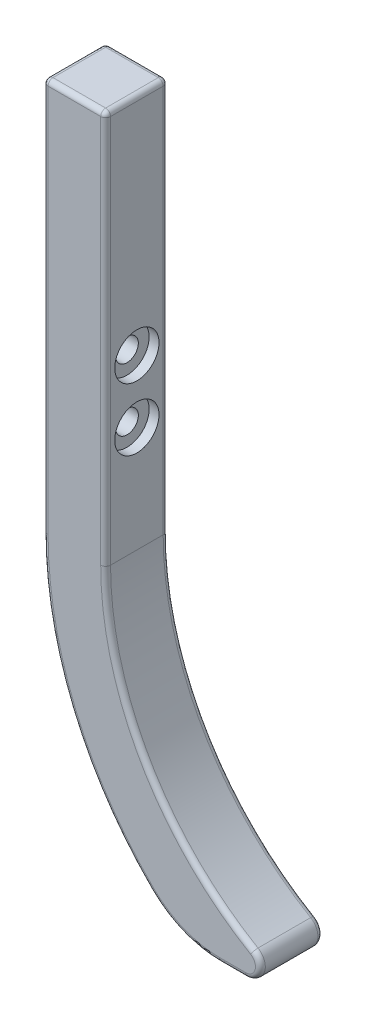
ISO-10303-21;
HEADER;
FILE_DESCRIPTION(('STEP AP214'),'2;1');
FILE_NAME('part.step','',(''),(''),'','','');
FILE_SCHEMA(('AUTOMOTIVE_DESIGN { 1 0 10303 214 1 1 1 1 }'));
ENDSEC;
DATA;
#1=APPLICATION_CONTEXT('core data for automotive mechanical design processes');
#2=APPLICATION_PROTOCOL_DEFINITION('international standard','automotive_design',2000,#1);
#3=PRODUCT_CONTEXT('',#1,'mechanical');
#4=PRODUCT('Part','Part','',(#3));
#5=PRODUCT_RELATED_PRODUCT_CATEGORY('part','',(#4));
#6=PRODUCT_DEFINITION_FORMATION('','',#4);
#7=PRODUCT_DEFINITION_CONTEXT('part definition',#1,'design');
#8=PRODUCT_DEFINITION('design','',#6,#7);
#9=PRODUCT_DEFINITION_SHAPE('','',#8);
#10=(LENGTH_UNIT() NAMED_UNIT(*) SI_UNIT(.MILLI.,.METRE.));
#11=(NAMED_UNIT(*) PLANE_ANGLE_UNIT() SI_UNIT($,.RADIAN.));
#12=(NAMED_UNIT(*) SI_UNIT($,.STERADIAN.) SOLID_ANGLE_UNIT());
#13=UNCERTAINTY_MEASURE_WITH_UNIT(LENGTH_MEASURE(1.E-05),#10,'distance_accuracy_value','');
#14=(GEOMETRIC_REPRESENTATION_CONTEXT(3) GLOBAL_UNCERTAINTY_ASSIGNED_CONTEXT((#13)) GLOBAL_UNIT_ASSIGNED_CONTEXT((#10,
#11,#12)) REPRESENTATION_CONTEXT('',''));
#15=CARTESIAN_POINT('',(0.,0.,0.));
#16=DIRECTION('',(0.,0.,1.));
#17=DIRECTION('',(1.,0.,0.));
#18=AXIS2_PLACEMENT_3D('',#15,#16,#17);
#19=CARTESIAN_POINT('',(-73.501,21.58,6.35));
#20=DIRECTION('',(1.,0.,0.));
#21=DIRECTION('',(0.,0.,-1.));
#22=AXIS2_PLACEMENT_3D('',#19,#20,#21);
#23=CYLINDRICAL_SURFACE('',#22,2.3);
#24=CARTESIAN_POINT('',(-73.5,21.58,6.35));
#25=DIRECTION('',(1.,0.,0.));
#26=DIRECTION('',(0.,1.,0.));
#27=AXIS2_PLACEMENT_3D('',#24,#25,#26);
#28=CIRCLE('',#27,2.3);
#29=CARTESIAN_POINT('',(-73.5,23.88,6.35));
#30=VERTEX_POINT('',#29);
#31=EDGE_CURVE('E398',#30,#30,#28,.F.);
#32=ORIENTED_EDGE('',*,*,#31,.T.);
#33=EDGE_LOOP('',(#32));
#34=FACE_BOUND('',#33,.T.);
#35=CARTESIAN_POINT('',(-62.8,21.58,6.35));
#36=DIRECTION('',(1.,0.,0.));
#37=DIRECTION('',(0.,0.,-1.));
#38=AXIS2_PLACEMENT_3D('',#35,#36,#37);
#39=CIRCLE('',#38,2.3);
#40=CARTESIAN_POINT('',(-62.8,21.58,4.05));
#41=VERTEX_POINT('',#40);
#42=EDGE_CURVE('E385',#41,#41,#39,.T.);
#43=ORIENTED_EDGE('',*,*,#42,.T.);
#44=EDGE_LOOP('',(#43));
#45=FACE_BOUND('',#44,.T.);
#46=ADVANCED_FACE('F40',(#34,#45),#23,.F.);
#47=CARTESIAN_POINT('',(-73.501,34.28,6.35));
#48=DIRECTION('',(1.,0.,0.));
#49=DIRECTION('',(0.,0.,-1.));
#50=AXIS2_PLACEMENT_3D('',#47,#48,#49);
#51=CYLINDRICAL_SURFACE('',#50,2.3);
#52=CARTESIAN_POINT('',(-73.5,34.28,6.35));
#53=DIRECTION('',(1.,0.,0.));
#54=DIRECTION('',(0.,1.,0.));
#55=AXIS2_PLACEMENT_3D('',#52,#53,#54);
#56=CIRCLE('',#55,2.3);
#57=CARTESIAN_POINT('',(-73.5,36.58,6.35));
#58=VERTEX_POINT('',#57);
#59=EDGE_CURVE('E191',#58,#58,#56,.F.);
#60=ORIENTED_EDGE('',*,*,#59,.T.);
#61=EDGE_LOOP('',(#60));
#62=FACE_BOUND('',#61,.T.);
#63=CARTESIAN_POINT('',(-62.8,34.28,6.35));
#64=DIRECTION('',(1.,0.,0.));
#65=DIRECTION('',(0.,0.,-1.));
#66=AXIS2_PLACEMENT_3D('',#63,#64,#65);
#67=CIRCLE('',#66,2.3);
#68=CARTESIAN_POINT('',(-62.8,34.28,4.05));
#69=VERTEX_POINT('',#68);
#70=EDGE_CURVE('E581',#69,#69,#67,.T.);
#71=ORIENTED_EDGE('',*,*,#70,.T.);
#72=EDGE_LOOP('',(#71));
#73=FACE_BOUND('',#72,.T.);
#74=ADVANCED_FACE('F517',(#62,#73),#51,.F.);
#75=CARTESIAN_POINT('',(0.,0.,12.7));
#76=DIRECTION('',(0.,0.,-1.));
#77=DIRECTION('',(-1.,0.,0.));
#78=AXIS2_PLACEMENT_3D('',#75,#76,#77);
#79=CYLINDRICAL_SURFACE('',#78,60.8);
#80=DIRECTION('',(0.,0.,-1.));
#81=VECTOR('',#80,1.);
#82=CARTESIAN_POINT('',(-30.8128916609415,-52.4137931034483,12.7));
#83=LINE('',#82,#81);
#84=CARTESIAN_POINT('',(-30.8128916609415,-52.4137931034483,11.7));
#85=VERTEX_POINT('',#84);
#86=CARTESIAN_POINT('',(-30.8128916609415,-52.4137931034483,1.));
#87=VERTEX_POINT('',#86);
#88=EDGE_CURVE('E406',#85,#87,#83,.T.);
#89=ORIENTED_EDGE('',*,*,#88,.T.);
#90=CARTESIAN_POINT('',(0.,0.,1.));
#91=DIRECTION('',(0.,0.,-1.));
#92=DIRECTION('',(-1.,0.,0.));
#93=AXIS2_PLACEMENT_3D('',#90,#91,#92);
#94=CIRCLE('',#93,60.8);
#95=CARTESIAN_POINT('',(-60.8,0.,1.));
#96=VERTEX_POINT('',#95);
#97=EDGE_CURVE('E328',#87,#96,#94,.T.);
#98=ORIENTED_EDGE('',*,*,#97,.T.);
#99=DIRECTION('',(0.,0.,-1.));
#100=VECTOR('',#99,1.);
#101=CARTESIAN_POINT('',(-60.8,0.,12.7));
#102=LINE('',#101,#100);
#103=CARTESIAN_POINT('',(-60.8,0.,11.7));
#104=VERTEX_POINT('',#103);
#105=EDGE_CURVE('E190',#104,#96,#102,.T.);
#106=ORIENTED_EDGE('',*,*,#105,.F.);
#107=CARTESIAN_POINT('',(0.,0.,11.7));
#108=DIRECTION('',(0.,0.,-1.));
#109=DIRECTION('',(-1.,0.,0.));
#110=AXIS2_PLACEMENT_3D('',#107,#108,#109);
#111=CIRCLE('',#110,60.8);
#112=EDGE_CURVE('E334',#104,#85,#111,.F.);
#113=ORIENTED_EDGE('',*,*,#112,.T.);
#114=EDGE_LOOP('',(#89,#98,#106,#113));
#115=FACE_BOUND('',#114,.T.);
#116=ADVANCED_FACE('F467',(#115),#79,.F.);
#117=CARTESIAN_POINT('',(-60.8,0.,12.7));
#118=DIRECTION('',(-1.,0.,0.));
#119=DIRECTION('',(0.,0.,1.));
#120=AXIS2_PLACEMENT_3D('',#117,#118,#119);
#121=PLANE('',#120);
#122=CARTESIAN_POINT('',(-60.8,34.28,6.35));
#123=DIRECTION('',(1.,0.,0.));
#124=DIRECTION('',(0.,0.,-1.));
#125=AXIS2_PLACEMENT_3D('',#122,#123,#124);
#126=CIRCLE('',#125,4.5);
#127=CARTESIAN_POINT('',(-60.8,34.28,1.85));
#128=VERTEX_POINT('',#127);
#129=EDGE_CURVE('E578',#128,#128,#126,.T.);
#130=ORIENTED_EDGE('',*,*,#129,.F.);
#131=EDGE_LOOP('',(#130));
#132=FACE_BOUND('',#131,.T.);
#133=CARTESIAN_POINT('',(-60.8,21.58,6.35));
#134=DIRECTION('',(1.,0.,0.));
#135=DIRECTION('',(0.,0.,-1.));
#136=AXIS2_PLACEMENT_3D('',#133,#134,#135);
#137=CIRCLE('',#136,4.5);
#138=CARTESIAN_POINT('',(-60.8,21.58,1.85));
#139=VERTEX_POINT('',#138);
#140=EDGE_CURVE('E378',#139,#139,#137,.T.);
#141=ORIENTED_EDGE('',*,*,#140,.F.);
#142=EDGE_LOOP('',(#141));
#143=FACE_BOUND('',#142,.T.);
#144=DIRECTION('',(0.,1.,0.));
#145=VECTOR('',#144,1.);
#146=CARTESIAN_POINT('',(-60.8,80.,1.));
#147=LINE('',#146,#145);
#148=CARTESIAN_POINT('',(-60.8,79.,1.));
#149=VERTEX_POINT('',#148);
#150=EDGE_CURVE('E235',#96,#149,#147,.T.);
#151=ORIENTED_EDGE('',*,*,#150,.T.);
#152=DIRECTION('',(0.,0.,-1.));
#153=VECTOR('',#152,1.);
#154=CARTESIAN_POINT('',(-60.8,79.,12.7));
#155=LINE('',#154,#153);
#156=CARTESIAN_POINT('',(-60.8,79.,11.7));
#157=VERTEX_POINT('',#156);
#158=EDGE_CURVE('E248',#149,#157,#155,.F.);
#159=ORIENTED_EDGE('',*,*,#158,.T.);
#160=DIRECTION('',(0.,1.,0.));
#161=VECTOR('',#160,1.);
#162=CARTESIAN_POINT('',(-60.8,0.,11.7));
#163=LINE('',#162,#161);
#164=EDGE_CURVE('E323',#157,#104,#163,.F.);
#165=ORIENTED_EDGE('',*,*,#164,.T.);
#166=ORIENTED_EDGE('',*,*,#105,.T.);
#167=EDGE_LOOP('',(#151,#159,#165,#166));
#168=FACE_BOUND('',#167,.T.);
#169=ADVANCED_FACE('F541',(#132,#143,#168),#121,.F.);
#170=CARTESIAN_POINT('',(-60.8,80.,12.7));
#171=DIRECTION('',(0.,-1.,0.));
#172=DIRECTION('',(0.,0.,-1.));
#173=AXIS2_PLACEMENT_3D('',#170,#171,#172);
#174=PLANE('',#173);
#175=DIRECTION('',(-1.,0.,0.));
#176=VECTOR('',#175,1.);
#177=CARTESIAN_POINT('',(-60.8,80.,11.7));
#178=LINE('',#177,#176);
#179=CARTESIAN_POINT('',(-72.5,80.,11.7));
#180=VERTEX_POINT('',#179);
#181=CARTESIAN_POINT('',(-61.8,80.,11.7));
#182=VERTEX_POINT('',#181);
#183=EDGE_CURVE('E234',#180,#182,#178,.F.);
#184=ORIENTED_EDGE('',*,*,#183,.T.);
#185=DIRECTION('',(0.,0.,-1.));
#186=VECTOR('',#185,1.);
#187=CARTESIAN_POINT('',(-61.8,80.,12.7));
#188=LINE('',#187,#186);
#189=CARTESIAN_POINT('',(-61.8,80.,1.));
#190=VERTEX_POINT('',#189);
#191=EDGE_CURVE('E244',#182,#190,#188,.T.);
#192=ORIENTED_EDGE('',*,*,#191,.T.);
#193=DIRECTION('',(-1.,0.,0.));
#194=VECTOR('',#193,1.);
#195=CARTESIAN_POINT('',(-72.5,80.,1.));
#196=LINE('',#195,#194);
#197=CARTESIAN_POINT('',(-72.5,80.,1.));
#198=VERTEX_POINT('',#197);
#199=EDGE_CURVE('E241',#190,#198,#196,.T.);
#200=ORIENTED_EDGE('',*,*,#199,.T.);
#201=DIRECTION('',(0.,0.,-1.));
#202=VECTOR('',#201,1.);
#203=CARTESIAN_POINT('',(-72.5,80.,12.7));
#204=LINE('',#203,#202);
#205=EDGE_CURVE('E238',#198,#180,#204,.F.);
#206=ORIENTED_EDGE('',*,*,#205,.T.);
#207=EDGE_LOOP('',(#184,#192,#200,#206));
#208=FACE_BOUND('',#207,.T.);
#209=ADVANCED_FACE('F303',(#208),#174,.F.);
#210=CARTESIAN_POINT('',(-73.5,80.,12.7));
#211=DIRECTION('',(1.,0.,0.));
#212=DIRECTION('',(0.,1.,0.));
#213=AXIS2_PLACEMENT_3D('',#210,#211,#212);
#214=PLANE('',#213);
#215=ORIENTED_EDGE('',*,*,#59,.F.);
#216=EDGE_LOOP('',(#215));
#217=FACE_BOUND('',#216,.T.);
#218=ORIENTED_EDGE('',*,*,#31,.F.);
#219=EDGE_LOOP('',(#218));
#220=FACE_BOUND('',#219,.T.);
#221=DIRECTION('',(0.,-1.,0.));
#222=VECTOR('',#221,1.);
#223=CARTESIAN_POINT('',(-73.5,80.,11.7));
#224=LINE('',#223,#222);
#225=CARTESIAN_POINT('',(-73.5,0.,11.7));
#226=VERTEX_POINT('',#225);
#227=CARTESIAN_POINT('',(-73.5,79.,11.7));
#228=VERTEX_POINT('',#227);
#229=EDGE_CURVE('E184',#226,#228,#224,.F.);
#230=ORIENTED_EDGE('',*,*,#229,.T.);
#231=DIRECTION('',(0.,0.,-1.));
#232=VECTOR('',#231,1.);
#233=CARTESIAN_POINT('',(-73.5,79.,12.7));
#234=LINE('',#233,#232);
#235=CARTESIAN_POINT('',(-73.5,79.,1.));
#236=VERTEX_POINT('',#235);
#237=EDGE_CURVE('E260',#228,#236,#234,.T.);
#238=ORIENTED_EDGE('',*,*,#237,.T.);
#239=DIRECTION('',(0.,-1.,0.));
#240=VECTOR('',#239,1.);
#241=CARTESIAN_POINT('',(-73.5,0.,1.));
#242=LINE('',#241,#240);
#243=CARTESIAN_POINT('',(-73.5,0.,1.));
#244=VERTEX_POINT('',#243);
#245=EDGE_CURVE('E187',#236,#244,#242,.T.);
#246=ORIENTED_EDGE('',*,*,#245,.T.);
#247=DIRECTION('',(0.,0.,-1.));
#248=VECTOR('',#247,1.);
#249=CARTESIAN_POINT('',(-73.5,0.,12.7));
#250=LINE('',#249,#248);
#251=EDGE_CURVE('E171',#226,#244,#250,.T.);
#252=ORIENTED_EDGE('',*,*,#251,.F.);
#253=EDGE_LOOP('',(#230,#238,#246,#252));
#254=FACE_BOUND('',#253,.T.);
#255=ADVANCED_FACE('F183',(#217,#220,#254),#214,.F.);
#256=CARTESIAN_POINT('',(0.,0.,12.7));
#257=DIRECTION('',(0.,0.,-1.));
#258=DIRECTION('',(-1.,0.,0.));
#259=AXIS2_PLACEMENT_3D('',#256,#257,#258);
#260=CYLINDRICAL_SURFACE('',#259,73.5);
#261=ORIENTED_EDGE('',*,*,#251,.T.);
#262=CARTESIAN_POINT('',(0.,0.,1.));
#263=DIRECTION('',(0.,0.,-1.));
#264=DIRECTION('',(-1.,0.,0.));
#265=AXIS2_PLACEMENT_3D('',#262,#263,#264);
#266=CIRCLE('',#265,73.5);
#267=CARTESIAN_POINT('',(-51.7380377284977,-52.2056074766355,1.));
#268=VERTEX_POINT('',#267);
#269=EDGE_CURVE('E179',#244,#268,#266,.F.);
#270=ORIENTED_EDGE('',*,*,#269,.T.);
#271=DIRECTION('',(0.,0.,-1.));
#272=VECTOR('',#271,1.);
#273=CARTESIAN_POINT('',(-51.7380377284977,-52.2056074766355,12.7));
#274=LINE('',#273,#272);
#275=CARTESIAN_POINT('',(-51.7380377284977,-52.2056074766355,11.7));
#276=VERTEX_POINT('',#275);
#277=EDGE_CURVE('E173',#268,#276,#274,.F.);
#278=ORIENTED_EDGE('',*,*,#277,.T.);
#279=CARTESIAN_POINT('',(0.,0.,11.7));
#280=DIRECTION('',(0.,0.,-1.));
#281=DIRECTION('',(-1.,0.,0.));
#282=AXIS2_PLACEMENT_3D('',#279,#280,#281);
#283=CIRCLE('',#282,73.5);
#284=EDGE_CURVE('E168',#276,#226,#283,.T.);
#285=ORIENTED_EDGE('',*,*,#284,.T.);
#286=EDGE_LOOP('',(#261,#270,#278,#285));
#287=FACE_BOUND('',#286,.T.);
#288=ADVANCED_FACE('F170',(#287),#260,.T.);
#289=CARTESIAN_POINT('',(-18.2384209842847,-58.,12.7));
#290=DIRECTION('',(0.,1.,0.));
#291=DIRECTION('',(0.,0.,1.));
#292=AXIS2_PLACEMENT_3D('',#289,#290,#291);
#293=PLANE('',#292);
#294=DIRECTION('',(0.,0.,-1.));
#295=VECTOR('',#294,1.);
#296=CARTESIAN_POINT('',(-37.659660115301,-58.,12.7));
#297=LINE('',#296,#295);
#298=CARTESIAN_POINT('',(-37.659660115301,-58.,11.7));
#299=VERTEX_POINT('',#298);
#300=CARTESIAN_POINT('',(-37.659660115301,-58.,1.));
#301=VERTEX_POINT('',#300);
#302=EDGE_CURVE('E414',#299,#301,#297,.T.);
#303=ORIENTED_EDGE('',*,*,#302,.T.);
#304=DIRECTION('',(1.,0.,0.));
#305=VECTOR('',#304,1.);
#306=CARTESIAN_POINT('',(-32.3332646047379,-58.,1.));
#307=LINE('',#306,#305);
#308=CARTESIAN_POINT('',(-32.3332646047379,-58.,1.));
#309=VERTEX_POINT('',#308);
#310=EDGE_CURVE('E454',#301,#309,#307,.T.);
#311=ORIENTED_EDGE('',*,*,#310,.T.);
#312=DIRECTION('',(0.,0.,-1.));
#313=VECTOR('',#312,1.);
#314=CARTESIAN_POINT('',(-32.3332646047379,-58.,12.7));
#315=LINE('',#314,#313);
#316=CARTESIAN_POINT('',(-32.3332646047379,-58.,11.7));
#317=VERTEX_POINT('',#316);
#318=EDGE_CURVE('E410',#309,#317,#315,.F.);
#319=ORIENTED_EDGE('',*,*,#318,.T.);
#320=DIRECTION('',(1.,0.,0.));
#321=VECTOR('',#320,1.);
#322=CARTESIAN_POINT('',(-18.2384209842847,-58.,11.7));
#323=LINE('',#322,#321);
#324=EDGE_CURVE('E451',#317,#299,#323,.F.);
#325=ORIENTED_EDGE('',*,*,#324,.T.);
#326=EDGE_LOOP('',(#303,#311,#319,#325));
#327=FACE_BOUND('',#326,.T.);
#328=ADVANCED_FACE('F487',(#327),#293,.F.);
#329=CARTESIAN_POINT('',(0.,0.,12.7));
#330=DIRECTION('',(0.,0.,-1.));
#331=DIRECTION('',(-1.,0.,0.));
#332=AXIS2_PLACEMENT_3D('',#329,#330,#331);
#333=PLANE('',#332);
#334=DIRECTION('',(0.,1.,0.));
#335=VECTOR('',#334,1.);
#336=CARTESIAN_POINT('',(-61.8,0.,12.7));
#337=LINE('',#336,#335);
#338=CARTESIAN_POINT('',(-61.8,0.,12.7));
#339=VERTEX_POINT('',#338);
#340=CARTESIAN_POINT('',(-61.8,79.,12.7));
#341=VERTEX_POINT('',#340);
#342=EDGE_CURVE('E322',#339,#341,#337,.T.);
#343=ORIENTED_EDGE('',*,*,#342,.T.);
#344=DIRECTION('',(-1.,0.,0.));
#345=VECTOR('',#344,1.);
#346=CARTESIAN_POINT('',(0.,79.,12.7));
#347=LINE('',#346,#345);
#348=CARTESIAN_POINT('',(-72.5,79.,12.7));
#349=VERTEX_POINT('',#348);
#350=EDGE_CURVE('E11',#341,#349,#347,.T.);
#351=ORIENTED_EDGE('',*,*,#350,.T.);
#352=DIRECTION('',(0.,-1.,0.));
#353=VECTOR('',#352,1.);
#354=CARTESIAN_POINT('',(-72.5,0.,12.7));
#355=LINE('',#354,#353);
#356=CARTESIAN_POINT('',(-72.5,0.,12.7));
#357=VERTEX_POINT('',#356);
#358=EDGE_CURVE('E348',#349,#357,#355,.T.);
#359=ORIENTED_EDGE('',*,*,#358,.T.);
#360=CARTESIAN_POINT('',(0.,0.,12.7));
#361=DIRECTION('',(0.,0.,-1.));
#362=DIRECTION('',(-1.,0.,0.));
#363=AXIS2_PLACEMENT_3D('',#360,#361,#362);
#364=CIRCLE('',#363,72.5);
#365=CARTESIAN_POINT('',(-51.0341188478379,-51.4953271028038,12.7));
#366=VERTEX_POINT('',#365);
#367=EDGE_CURVE('E200',#357,#366,#364,.F.);
#368=ORIENTED_EDGE('',*,*,#367,.T.);
#369=CARTESIAN_POINT('',(-37.659660115301,-38.,12.7));
#370=DIRECTION('',(0.,0.,-1.));
#371=DIRECTION('',(-1.,0.,0.));
#372=AXIS2_PLACEMENT_3D('',#369,#370,#371);
#373=CIRCLE('',#372,19.);
#374=CARTESIAN_POINT('',(-37.659660115301,-57.,12.7));
#375=VERTEX_POINT('',#374);
#376=EDGE_CURVE('E343',#366,#375,#373,.F.);
#377=ORIENTED_EDGE('',*,*,#376,.T.);
#378=DIRECTION('',(1.,0.,0.));
#379=VECTOR('',#378,1.);
#380=CARTESIAN_POINT('',(0.,-57.,12.7));
#381=LINE('',#380,#379);
#382=CARTESIAN_POINT('',(-32.3332646047379,-57.,12.7));
#383=VERTEX_POINT('',#382);
#384=EDGE_CURVE('E340',#375,#383,#381,.T.);
#385=ORIENTED_EDGE('',*,*,#384,.T.);
#386=CARTESIAN_POINT('',(-32.3332646047379,-55.,12.7));
#387=DIRECTION('',(0.,0.,-1.));
#388=DIRECTION('',(-1.,0.,0.));
#389=AXIS2_PLACEMENT_3D('',#386,#387,#388);
#390=CIRCLE('',#389,2.);
#391=CARTESIAN_POINT('',(-31.3196826422069,-53.2758620689655,12.7));
#392=VERTEX_POINT('',#391);
#393=EDGE_CURVE('E332',#383,#392,#390,.F.);
#394=ORIENTED_EDGE('',*,*,#393,.T.);
#395=CARTESIAN_POINT('',(0.,0.,12.7));
#396=DIRECTION('',(0.,0.,-1.));
#397=DIRECTION('',(-1.,0.,0.));
#398=AXIS2_PLACEMENT_3D('',#395,#396,#397);
#399=CIRCLE('',#398,61.8);
#400=EDGE_CURVE('E326',#392,#339,#399,.T.);
#401=ORIENTED_EDGE('',*,*,#400,.T.);
#402=EDGE_LOOP('',(#343,#351,#359,#368,#377,#385,#394,#401));
#403=FACE_BOUND('',#402,.T.);
#404=ADVANCED_FACE('F324',(#403),#333,.F.);
#405=CARTESIAN_POINT('',(0.,0.,0.));
#406=DIRECTION('',(0.,0.,-1.));
#407=DIRECTION('',(-1.,0.,0.));
#408=AXIS2_PLACEMENT_3D('',#405,#406,#407);
#409=PLANE('',#408);
#410=DIRECTION('',(0.,-1.,0.));
#411=VECTOR('',#410,1.);
#412=CARTESIAN_POINT('',(-72.5,80.,0.));
#413=LINE('',#412,#411);
#414=CARTESIAN_POINT('',(-72.5,0.,0.));
#415=VERTEX_POINT('',#414);
#416=CARTESIAN_POINT('',(-72.5,79.,0.));
#417=VERTEX_POINT('',#416);
#418=EDGE_CURVE('E180',#415,#417,#413,.F.);
#419=ORIENTED_EDGE('',*,*,#418,.T.);
#420=DIRECTION('',(-1.,0.,0.));
#421=VECTOR('',#420,1.);
#422=CARTESIAN_POINT('',(-61.8,79.,0.));
#423=LINE('',#422,#421);
#424=CARTESIAN_POINT('',(-61.8,79.,0.));
#425=VERTEX_POINT('',#424);
#426=EDGE_CURVE('E254',#417,#425,#423,.F.);
#427=ORIENTED_EDGE('',*,*,#426,.T.);
#428=DIRECTION('',(0.,1.,0.));
#429=VECTOR('',#428,1.);
#430=CARTESIAN_POINT('',(-61.8,0.,0.));
#431=LINE('',#430,#429);
#432=CARTESIAN_POINT('',(-61.8,0.,0.));
#433=VERTEX_POINT('',#432);
#434=EDGE_CURVE('E422',#425,#433,#431,.F.);
#435=ORIENTED_EDGE('',*,*,#434,.T.);
#436=CARTESIAN_POINT('',(0.,0.,0.));
#437=DIRECTION('',(0.,0.,-1.));
#438=DIRECTION('',(-1.,0.,0.));
#439=AXIS2_PLACEMENT_3D('',#436,#437,#438);
#440=CIRCLE('',#439,61.8);
#441=CARTESIAN_POINT('',(-31.3196826422069,-53.2758620689655,0.));
#442=VERTEX_POINT('',#441);
#443=EDGE_CURVE('E425',#433,#442,#440,.F.);
#444=ORIENTED_EDGE('',*,*,#443,.T.);
#445=CARTESIAN_POINT('',(-32.3332646047379,-55.,0.));
#446=DIRECTION('',(0.,0.,-1.));
#447=DIRECTION('',(-1.,0.,0.));
#448=AXIS2_PLACEMENT_3D('',#445,#446,#447);
#449=CIRCLE('',#448,2.);
#450=CARTESIAN_POINT('',(-32.3332646047379,-57.,0.));
#451=VERTEX_POINT('',#450);
#452=EDGE_CURVE('E428',#442,#451,#449,.T.);
#453=ORIENTED_EDGE('',*,*,#452,.T.);
#454=DIRECTION('',(1.,0.,0.));
#455=VECTOR('',#454,1.);
#456=CARTESIAN_POINT('',(-37.659660115301,-57.,0.));
#457=LINE('',#456,#455);
#458=CARTESIAN_POINT('',(-37.659660115301,-57.,0.));
#459=VERTEX_POINT('',#458);
#460=EDGE_CURVE('E431',#451,#459,#457,.F.);
#461=ORIENTED_EDGE('',*,*,#460,.T.);
#462=CARTESIAN_POINT('',(-37.659660115301,-38.,0.));
#463=DIRECTION('',(0.,0.,-1.));
#464=DIRECTION('',(-1.,0.,0.));
#465=AXIS2_PLACEMENT_3D('',#462,#463,#464);
#466=CIRCLE('',#465,19.);
#467=CARTESIAN_POINT('',(-51.0341188478379,-51.4953271028038,0.));
#468=VERTEX_POINT('',#467);
#469=EDGE_CURVE('E434',#459,#468,#466,.T.);
#470=ORIENTED_EDGE('',*,*,#469,.T.);
#471=CARTESIAN_POINT('',(0.,0.,0.));
#472=DIRECTION('',(0.,0.,-1.));
#473=DIRECTION('',(-1.,0.,0.));
#474=AXIS2_PLACEMENT_3D('',#471,#472,#473);
#475=CIRCLE('',#474,72.5);
#476=EDGE_CURVE('E437',#468,#415,#475,.T.);
#477=ORIENTED_EDGE('',*,*,#476,.T.);
#478=EDGE_LOOP('',(#419,#427,#435,#444,#453,#461,#470,#477));
#479=FACE_BOUND('',#478,.T.);
#480=ADVANCED_FACE('F504',(#479),#409,.T.);
#481=CARTESIAN_POINT('',(-32.3332646047379,-55.,12.7));
#482=DIRECTION('',(0.,0.,-1.));
#483=DIRECTION('',(-1.,0.,0.));
#484=AXIS2_PLACEMENT_3D('',#481,#482,#483);
#485=CYLINDRICAL_SURFACE('',#484,3.);
#486=ORIENTED_EDGE('',*,*,#318,.F.);
#487=CARTESIAN_POINT('',(-32.3332646047379,-55.,1.));
#488=DIRECTION('',(0.,0.,-1.));
#489=DIRECTION('',(-1.,0.,0.));
#490=AXIS2_PLACEMENT_3D('',#487,#488,#489);
#491=CIRCLE('',#490,3.);
#492=EDGE_CURVE('E460',#309,#87,#491,.F.);
#493=ORIENTED_EDGE('',*,*,#492,.T.);
#494=ORIENTED_EDGE('',*,*,#88,.F.);
#495=CARTESIAN_POINT('',(-32.3332646047379,-55.,11.7));
#496=DIRECTION('',(0.,0.,-1.));
#497=DIRECTION('',(-1.,0.,0.));
#498=AXIS2_PLACEMENT_3D('',#495,#496,#497);
#499=CIRCLE('',#498,3.);
#500=EDGE_CURVE('E457',#85,#317,#499,.T.);
#501=ORIENTED_EDGE('',*,*,#500,.T.);
#502=EDGE_LOOP('',(#486,#493,#494,#501));
#503=FACE_BOUND('',#502,.T.);
#504=ADVANCED_FACE('F472',(#503),#485,.T.);
#505=CARTESIAN_POINT('',(-37.659660115301,-38.,12.7));
#506=DIRECTION('',(0.,0.,-1.));
#507=DIRECTION('',(-1.,0.,0.));
#508=AXIS2_PLACEMENT_3D('',#505,#506,#507);
#509=CYLINDRICAL_SURFACE('',#508,20.);
#510=ORIENTED_EDGE('',*,*,#277,.F.);
#511=CARTESIAN_POINT('',(-37.659660115301,-38.,1.));
#512=DIRECTION('',(0.,0.,-1.));
#513=DIRECTION('',(-1.,0.,0.));
#514=AXIS2_PLACEMENT_3D('',#511,#512,#513);
#515=CIRCLE('',#514,20.);
#516=EDGE_CURVE('E448',#268,#301,#515,.F.);
#517=ORIENTED_EDGE('',*,*,#516,.T.);
#518=ORIENTED_EDGE('',*,*,#302,.F.);
#519=CARTESIAN_POINT('',(-37.659660115301,-38.,11.7));
#520=DIRECTION('',(0.,0.,-1.));
#521=DIRECTION('',(-1.,0.,0.));
#522=AXIS2_PLACEMENT_3D('',#519,#520,#521);
#523=CIRCLE('',#522,20.);
#524=EDGE_CURVE('E445',#299,#276,#523,.T.);
#525=ORIENTED_EDGE('',*,*,#524,.T.);
#526=EDGE_LOOP('',(#510,#517,#518,#525));
#527=FACE_BOUND('',#526,.T.);
#528=ADVANCED_FACE('F490',(#527),#509,.T.);
#529=CARTESIAN_POINT('',(-62.8,34.28,6.35));
#530=DIRECTION('',(1.,0.,0.));
#531=DIRECTION('',(0.,0.,-1.));
#532=AXIS2_PLACEMENT_3D('',#529,#530,#531);
#533=CYLINDRICAL_SURFACE('',#532,4.5);
#534=CARTESIAN_POINT('',(-62.8,34.28,6.35));
#535=DIRECTION('',(1.,0.,0.));
#536=DIRECTION('',(0.,0.,-1.));
#537=AXIS2_PLACEMENT_3D('',#534,#535,#536);
#538=CIRCLE('',#537,4.5);
#539=CARTESIAN_POINT('',(-62.8,34.28,1.85));
#540=VERTEX_POINT('',#539);
#541=EDGE_CURVE('E401',#540,#540,#538,.T.);
#542=ORIENTED_EDGE('',*,*,#541,.F.);
#543=EDGE_LOOP('',(#542));
#544=FACE_BOUND('',#543,.T.);
#545=ORIENTED_EDGE('',*,*,#129,.T.);
#546=EDGE_LOOP('',(#545));
#547=FACE_BOUND('',#546,.T.);
#548=ADVANCED_FACE('F549',(#544,#547),#533,.F.);
#549=CARTESIAN_POINT('',(-62.8,0.,0.));
#550=DIRECTION('',(1.,0.,0.));
#551=DIRECTION('',(0.,0.,-1.));
#552=AXIS2_PLACEMENT_3D('',#549,#550,#551);
#553=PLANE('',#552);
#554=ORIENTED_EDGE('',*,*,#70,.F.);
#555=EDGE_LOOP('',(#554));
#556=FACE_BOUND('',#555,.T.);
#557=ORIENTED_EDGE('',*,*,#541,.T.);
#558=EDGE_LOOP('',(#557));
#559=FACE_BOUND('',#558,.T.);
#560=ADVANCED_FACE('F554',(#556,#559),#553,.T.);
#561=CARTESIAN_POINT('',(-62.8,21.58,6.35));
#562=DIRECTION('',(1.,0.,0.));
#563=DIRECTION('',(0.,0.,-1.));
#564=AXIS2_PLACEMENT_3D('',#561,#562,#563);
#565=CYLINDRICAL_SURFACE('',#564,4.5);
#566=CARTESIAN_POINT('',(-62.8,21.58,6.35));
#567=DIRECTION('',(1.,0.,0.));
#568=DIRECTION('',(0.,0.,-1.));
#569=AXIS2_PLACEMENT_3D('',#566,#567,#568);
#570=CIRCLE('',#569,4.5);
#571=CARTESIAN_POINT('',(-62.8,21.58,1.85));
#572=VERTEX_POINT('',#571);
#573=EDGE_CURVE('E391',#572,#572,#570,.T.);
#574=ORIENTED_EDGE('',*,*,#573,.F.);
#575=EDGE_LOOP('',(#574));
#576=FACE_BOUND('',#575,.T.);
#577=ORIENTED_EDGE('',*,*,#140,.T.);
#578=EDGE_LOOP('',(#577));
#579=FACE_BOUND('',#578,.T.);
#580=ADVANCED_FACE('F560',(#576,#579),#565,.F.);
#581=CARTESIAN_POINT('',(-62.8,0.,0.));
#582=DIRECTION('',(1.,0.,0.));
#583=DIRECTION('',(0.,0.,-1.));
#584=AXIS2_PLACEMENT_3D('',#581,#582,#583);
#585=PLANE('',#584);
#586=ORIENTED_EDGE('',*,*,#42,.F.);
#587=EDGE_LOOP('',(#586));
#588=FACE_BOUND('',#587,.T.);
#589=ORIENTED_EDGE('',*,*,#573,.T.);
#590=EDGE_LOOP('',(#589));
#591=FACE_BOUND('',#590,.T.);
#592=ADVANCED_FACE('F566',(#588,#591),#585,.T.);
#593=CARTESIAN_POINT('',(-61.8,0.,1.));
#594=DIRECTION('',(0.,-1.,0.));
#595=DIRECTION('',(0.,0.,-1.));
#596=AXIS2_PLACEMENT_3D('',#593,#594,#595);
#597=CYLINDRICAL_SURFACE('',#596,1.);
#598=ORIENTED_EDGE('',*,*,#434,.F.);
#599=CARTESIAN_POINT('',(-61.8,79.,1.));
#600=DIRECTION('',(0.,-1.,0.));
#601=DIRECTION('',(0.,0.,-1.));
#602=AXIS2_PLACEMENT_3D('',#599,#600,#601);
#603=CIRCLE('',#602,1.);
#604=EDGE_CURVE('E251',#425,#149,#603,.T.);
#605=ORIENTED_EDGE('',*,*,#604,.T.);
#606=ORIENTED_EDGE('',*,*,#150,.F.);
#607=CARTESIAN_POINT('',(-61.8,0.,1.));
#608=DIRECTION('',(0.,-1.,0.));
#609=DIRECTION('',(0.,0.,-1.));
#610=AXIS2_PLACEMENT_3D('',#607,#608,#609);
#611=CIRCLE('',#610,1.);
#612=EDGE_CURVE('E211',#433,#96,#611,.T.);
#613=ORIENTED_EDGE('',*,*,#612,.F.);
#614=EDGE_LOOP('',(#598,#605,#606,#613));
#615=FACE_BOUND('',#614,.T.);
#616=ADVANCED_FACE('F568',(#615),#597,.T.);
#617=CARTESIAN_POINT('',(0.,0.,1.));
#618=DIRECTION('',(0.,0.,-1.));
#619=DIRECTION('',(-1.,0.,0.));
#620=AXIS2_PLACEMENT_3D('',#617,#618,#619);
#621=TOROIDAL_SURFACE('',#620,61.8,1.);
#622=ORIENTED_EDGE('',*,*,#612,.T.);
#623=ORIENTED_EDGE('',*,*,#97,.F.);
#624=CARTESIAN_POINT('',(-31.3196826422069,-53.2758620689655,1.));
#625=DIRECTION('',(0.862068965517245,-0.50679098126548,0.));
#626=DIRECTION('',(0.50679098126548,0.862068965517245,0.));
#627=AXIS2_PLACEMENT_3D('',#624,#625,#626);
#628=CIRCLE('',#627,1.);
#629=EDGE_CURVE('E369',#442,#87,#628,.T.);
#630=ORIENTED_EDGE('',*,*,#629,.F.);
#631=ORIENTED_EDGE('',*,*,#443,.F.);
#632=EDGE_LOOP('',(#622,#623,#630,#631));
#633=FACE_BOUND('',#632,.T.);
#634=ADVANCED_FACE('F602',(#633),#621,.T.);
#635=CARTESIAN_POINT('',(-32.3332646047379,-55.,1.));
#636=DIRECTION('',(0.,0.,-1.));
#637=DIRECTION('',(-1.,0.,0.));
#638=AXIS2_PLACEMENT_3D('',#635,#636,#637);
#639=TOROIDAL_SURFACE('',#638,2.,1.);
#640=ORIENTED_EDGE('',*,*,#629,.T.);
#641=ORIENTED_EDGE('',*,*,#492,.F.);
#642=CARTESIAN_POINT('',(-32.3332646047379,-57.,1.));
#643=DIRECTION('',(-1.,0.,0.));
#644=DIRECTION('',(0.,0.,1.));
#645=AXIS2_PLACEMENT_3D('',#642,#643,#644);
#646=CIRCLE('',#645,1.);
#647=EDGE_CURVE('E366',#451,#309,#646,.T.);
#648=ORIENTED_EDGE('',*,*,#647,.F.);
#649=ORIENTED_EDGE('',*,*,#452,.F.);
#650=EDGE_LOOP('',(#640,#641,#648,#649));
#651=FACE_BOUND('',#650,.T.);
#652=ADVANCED_FACE('F603',(#651),#639,.T.);
#653=CARTESIAN_POINT('',(-18.2384209842847,-57.,1.));
#654=DIRECTION('',(-1.,0.,0.));
#655=DIRECTION('',(0.,0.,1.));
#656=AXIS2_PLACEMENT_3D('',#653,#654,#655);
#657=CYLINDRICAL_SURFACE('',#656,1.);
#658=ORIENTED_EDGE('',*,*,#647,.T.);
#659=ORIENTED_EDGE('',*,*,#310,.F.);
#660=CARTESIAN_POINT('',(-37.659660115301,-57.,1.));
#661=DIRECTION('',(-1.,0.,0.));
#662=DIRECTION('',(0.,0.,1.));
#663=AXIS2_PLACEMENT_3D('',#660,#661,#662);
#664=CIRCLE('',#663,1.);
#665=EDGE_CURVE('E362',#459,#301,#664,.T.);
#666=ORIENTED_EDGE('',*,*,#665,.F.);
#667=ORIENTED_EDGE('',*,*,#460,.F.);
#668=EDGE_LOOP('',(#658,#659,#666,#667));
#669=FACE_BOUND('',#668,.T.);
#670=ADVANCED_FACE('F606',(#669),#657,.T.);
#671=CARTESIAN_POINT('',(-37.659660115301,-38.,1.));
#672=DIRECTION('',(0.,0.,-1.));
#673=DIRECTION('',(-1.,0.,0.));
#674=AXIS2_PLACEMENT_3D('',#671,#672,#673);
#675=TOROIDAL_SURFACE('',#674,19.,1.);
#676=ORIENTED_EDGE('',*,*,#665,.T.);
#677=ORIENTED_EDGE('',*,*,#516,.F.);
#678=CARTESIAN_POINT('',(-51.0341188478379,-51.4953271028038,1.));
#679=DIRECTION('',(-0.710280373831777,0.703918880659833,0.));
#680=DIRECTION('',(-0.703918880659833,-0.710280373831777,0.));
#681=AXIS2_PLACEMENT_3D('',#678,#679,#680);
#682=CIRCLE('',#681,1.);
#683=EDGE_CURVE('E358',#468,#268,#682,.T.);
#684=ORIENTED_EDGE('',*,*,#683,.F.);
#685=ORIENTED_EDGE('',*,*,#469,.F.);
#686=EDGE_LOOP('',(#676,#677,#684,#685));
#687=FACE_BOUND('',#686,.T.);
#688=ADVANCED_FACE('F494',(#687),#675,.T.);
#689=CARTESIAN_POINT('',(0.,0.,1.));
#690=DIRECTION('',(0.,0.,-1.));
#691=DIRECTION('',(-1.,0.,0.));
#692=AXIS2_PLACEMENT_3D('',#689,#690,#691);
#693=TOROIDAL_SURFACE('',#692,72.5,1.);
#694=ORIENTED_EDGE('',*,*,#683,.T.);
#695=ORIENTED_EDGE('',*,*,#269,.F.);
#696=CARTESIAN_POINT('',(-72.5,0.,1.));
#697=DIRECTION('',(0.,1.,0.));
#698=DIRECTION('',(-1.,0.,0.));
#699=AXIS2_PLACEMENT_3D('',#696,#697,#698);
#700=CIRCLE('',#699,1.);
#701=EDGE_CURVE('E229',#415,#244,#700,.T.);
#702=ORIENTED_EDGE('',*,*,#701,.F.);
#703=ORIENTED_EDGE('',*,*,#476,.F.);
#704=EDGE_LOOP('',(#694,#695,#702,#703));
#705=FACE_BOUND('',#704,.T.);
#706=ADVANCED_FACE('F500',(#705),#693,.T.);
#707=CARTESIAN_POINT('',(-72.5,80.,1.));
#708=DIRECTION('',(0.,1.,0.));
#709=DIRECTION('',(-1.,0.,0.));
#710=AXIS2_PLACEMENT_3D('',#707,#708,#709);
#711=CYLINDRICAL_SURFACE('',#710,1.);
#712=ORIENTED_EDGE('',*,*,#245,.F.);
#713=CARTESIAN_POINT('',(-72.5,79.,1.));
#714=DIRECTION('',(0.,1.,0.));
#715=DIRECTION('',(-1.,0.,0.));
#716=AXIS2_PLACEMENT_3D('',#713,#714,#715);
#717=CIRCLE('',#716,1.);
#718=EDGE_CURVE('E257',#236,#417,#717,.F.);
#719=ORIENTED_EDGE('',*,*,#718,.T.);
#720=ORIENTED_EDGE('',*,*,#418,.F.);
#721=ORIENTED_EDGE('',*,*,#701,.T.);
#722=EDGE_LOOP('',(#712,#719,#720,#721));
#723=FACE_BOUND('',#722,.T.);
#724=ADVANCED_FACE('F506',(#723),#711,.T.);
#725=CARTESIAN_POINT('',(-61.8,0.,11.7));
#726=DIRECTION('',(0.,1.,0.));
#727=DIRECTION('',(0.,0.,1.));
#728=AXIS2_PLACEMENT_3D('',#725,#726,#727);
#729=CYLINDRICAL_SURFACE('',#728,1.);
#730=ORIENTED_EDGE('',*,*,#164,.F.);
#731=CARTESIAN_POINT('',(-61.8,79.,11.7));
#732=DIRECTION('',(0.,1.,0.));
#733=DIRECTION('',(0.,0.,1.));
#734=AXIS2_PLACEMENT_3D('',#731,#732,#733);
#735=CIRCLE('',#734,1.);
#736=EDGE_CURVE('E230',#157,#341,#735,.F.);
#737=ORIENTED_EDGE('',*,*,#736,.T.);
#738=ORIENTED_EDGE('',*,*,#342,.F.);
#739=CARTESIAN_POINT('',(-61.8,0.,11.7));
#740=DIRECTION('',(0.,-1.,0.));
#741=DIRECTION('',(0.,0.,-1.));
#742=AXIS2_PLACEMENT_3D('',#739,#740,#741);
#743=CIRCLE('',#742,1.);
#744=EDGE_CURVE('E225',#104,#339,#743,.T.);
#745=ORIENTED_EDGE('',*,*,#744,.F.);
#746=EDGE_LOOP('',(#730,#737,#738,#745));
#747=FACE_BOUND('',#746,.T.);
#748=ADVANCED_FACE('F320',(#747),#729,.T.);
#749=CARTESIAN_POINT('',(0.,0.,11.7));
#750=DIRECTION('',(0.,0.,-1.));
#751=DIRECTION('',(-1.,0.,0.));
#752=AXIS2_PLACEMENT_3D('',#749,#750,#751);
#753=TOROIDAL_SURFACE('',#752,61.8,1.);
#754=ORIENTED_EDGE('',*,*,#744,.T.);
#755=ORIENTED_EDGE('',*,*,#400,.F.);
#756=CARTESIAN_POINT('',(-31.319682642207,-53.2758620689655,11.7));
#757=DIRECTION('',(0.862068965517242,-0.506790981265485,0.));
#758=DIRECTION('',(0.506790981265485,0.862068965517242,0.));
#759=AXIS2_PLACEMENT_3D('',#756,#757,#758);
#760=CIRCLE('',#759,1.);
#761=EDGE_CURVE('E221',#85,#392,#760,.T.);
#762=ORIENTED_EDGE('',*,*,#761,.F.);
#763=ORIENTED_EDGE('',*,*,#112,.F.);
#764=EDGE_LOOP('',(#754,#755,#762,#763));
#765=FACE_BOUND('',#764,.T.);
#766=ADVANCED_FACE('F474',(#765),#753,.T.);
#767=CARTESIAN_POINT('',(-32.3332646047379,-55.,11.7));
#768=DIRECTION('',(0.,0.,-1.));
#769=DIRECTION('',(-1.,0.,0.));
#770=AXIS2_PLACEMENT_3D('',#767,#768,#769);
#771=TOROIDAL_SURFACE('',#770,2.,1.);
#772=ORIENTED_EDGE('',*,*,#761,.T.);
#773=ORIENTED_EDGE('',*,*,#393,.F.);
#774=CARTESIAN_POINT('',(-32.3332646047379,-57.,11.7));
#775=DIRECTION('',(-1.,0.,0.));
#776=DIRECTION('',(0.,0.,1.));
#777=AXIS2_PLACEMENT_3D('',#774,#775,#776);
#778=CIRCLE('',#777,1.);
#779=EDGE_CURVE('E217',#317,#383,#778,.T.);
#780=ORIENTED_EDGE('',*,*,#779,.F.);
#781=ORIENTED_EDGE('',*,*,#500,.F.);
#782=EDGE_LOOP('',(#772,#773,#780,#781));
#783=FACE_BOUND('',#782,.T.);
#784=ADVANCED_FACE('F478',(#783),#771,.T.);
#785=CARTESIAN_POINT('',(0.,-57.,11.7));
#786=DIRECTION('',(1.,0.,0.));
#787=DIRECTION('',(0.,0.,-1.));
#788=AXIS2_PLACEMENT_3D('',#785,#786,#787);
#789=CYLINDRICAL_SURFACE('',#788,1.);
#790=ORIENTED_EDGE('',*,*,#779,.T.);
#791=ORIENTED_EDGE('',*,*,#384,.F.);
#792=CARTESIAN_POINT('',(-37.659660115301,-57.,11.7));
#793=DIRECTION('',(-1.,0.,0.));
#794=DIRECTION('',(0.,0.,1.));
#795=AXIS2_PLACEMENT_3D('',#792,#793,#794);
#796=CIRCLE('',#795,1.);
#797=EDGE_CURVE('E206',#299,#375,#796,.T.);
#798=ORIENTED_EDGE('',*,*,#797,.F.);
#799=ORIENTED_EDGE('',*,*,#324,.F.);
#800=EDGE_LOOP('',(#790,#791,#798,#799));
#801=FACE_BOUND('',#800,.T.);
#802=ADVANCED_FACE('F483',(#801),#789,.T.);
#803=CARTESIAN_POINT('',(-37.659660115301,-38.,11.7));
#804=DIRECTION('',(0.,0.,-1.));
#805=DIRECTION('',(-1.,0.,0.));
#806=AXIS2_PLACEMENT_3D('',#803,#804,#805);
#807=TOROIDAL_SURFACE('',#806,19.,1.);
#808=ORIENTED_EDGE('',*,*,#797,.T.);
#809=ORIENTED_EDGE('',*,*,#376,.F.);
#810=CARTESIAN_POINT('',(-51.0341188478379,-51.4953271028038,11.7));
#811=DIRECTION('',(-0.710280373831777,0.703918880659833,0.));
#812=DIRECTION('',(-0.703918880659833,-0.710280373831777,0.));
#813=AXIS2_PLACEMENT_3D('',#810,#811,#812);
#814=CIRCLE('',#813,1.);
#815=EDGE_CURVE('E202',#276,#366,#814,.T.);
#816=ORIENTED_EDGE('',*,*,#815,.F.);
#817=ORIENTED_EDGE('',*,*,#524,.F.);
#818=EDGE_LOOP('',(#808,#809,#816,#817));
#819=FACE_BOUND('',#818,.T.);
#820=ADVANCED_FACE('F624',(#819),#807,.T.);
#821=CARTESIAN_POINT('',(0.,0.,11.7));
#822=DIRECTION('',(0.,0.,-1.));
#823=DIRECTION('',(-1.,0.,0.));
#824=AXIS2_PLACEMENT_3D('',#821,#822,#823);
#825=TOROIDAL_SURFACE('',#824,72.5,1.);
#826=ORIENTED_EDGE('',*,*,#815,.T.);
#827=ORIENTED_EDGE('',*,*,#367,.F.);
#828=CARTESIAN_POINT('',(-72.5,0.,11.7));
#829=DIRECTION('',(0.,1.,0.));
#830=DIRECTION('',(0.,0.,1.));
#831=AXIS2_PLACEMENT_3D('',#828,#829,#830);
#832=CIRCLE('',#831,1.);
#833=EDGE_CURVE('E195',#226,#357,#832,.T.);
#834=ORIENTED_EDGE('',*,*,#833,.F.);
#835=ORIENTED_EDGE('',*,*,#284,.F.);
#836=EDGE_LOOP('',(#826,#827,#834,#835));
#837=FACE_BOUND('',#836,.T.);
#838=ADVANCED_FACE('F199',(#837),#825,.T.);
#839=CARTESIAN_POINT('',(-72.5,0.,11.7));
#840=DIRECTION('',(0.,-1.,0.));
#841=DIRECTION('',(1.,0.,0.));
#842=AXIS2_PLACEMENT_3D('',#839,#840,#841);
#843=CYLINDRICAL_SURFACE('',#842,1.);
#844=ORIENTED_EDGE('',*,*,#358,.F.);
#845=CARTESIAN_POINT('',(-72.5,79.,11.7));
#846=DIRECTION('',(0.,-1.,0.));
#847=DIRECTION('',(1.,0.,0.));
#848=AXIS2_PLACEMENT_3D('',#845,#846,#847);
#849=CIRCLE('',#848,1.);
#850=EDGE_CURVE('E50',#349,#228,#849,.T.);
#851=ORIENTED_EDGE('',*,*,#850,.T.);
#852=ORIENTED_EDGE('',*,*,#229,.F.);
#853=ORIENTED_EDGE('',*,*,#833,.T.);
#854=EDGE_LOOP('',(#844,#851,#852,#853));
#855=FACE_BOUND('',#854,.T.);
#856=ADVANCED_FACE('F194',(#855),#843,.T.);
#857=CARTESIAN_POINT('',(-72.5,79.,1.));
#858=DIRECTION('',(0.,-1.,0.));
#859=DIRECTION('',(0.,0.,-1.));
#860=AXIS2_PLACEMENT_3D('',#857,#858,#859);
#861=SPHERICAL_SURFACE('',#860,1.);
#862=CARTESIAN_POINT('',(-72.5,79.,1.));
#863=DIRECTION('',(1.,0.,0.));
#864=DIRECTION('',(0.,0.,-1.));
#865=AXIS2_PLACEMENT_3D('',#862,#863,#864);
#866=CIRCLE('',#865,1.);
#867=EDGE_CURVE('E209',#417,#198,#866,.T.);
#868=ORIENTED_EDGE('',*,*,#867,.F.);
#869=ORIENTED_EDGE('',*,*,#718,.F.);
#870=CARTESIAN_POINT('',(-72.5,79.,1.));
#871=DIRECTION('',(0.,0.,1.));
#872=DIRECTION('',(1.,0.,0.));
#873=AXIS2_PLACEMENT_3D('',#870,#871,#872);
#874=CIRCLE('',#873,1.);
#875=EDGE_CURVE('E44',#198,#236,#874,.T.);
#876=ORIENTED_EDGE('',*,*,#875,.F.);
#877=EDGE_LOOP('',(#868,#869,#876));
#878=FACE_BOUND('',#877,.T.);
#879=ADVANCED_FACE('F42',(#878),#861,.T.);
#880=CARTESIAN_POINT('',(-72.5,79.,12.7));
#881=DIRECTION('',(0.,0.,-1.));
#882=DIRECTION('',(-1.,0.,0.));
#883=AXIS2_PLACEMENT_3D('',#880,#881,#882);
#884=CYLINDRICAL_SURFACE('',#883,1.);
#885=ORIENTED_EDGE('',*,*,#875,.T.);
#886=ORIENTED_EDGE('',*,*,#237,.F.);
#887=CARTESIAN_POINT('',(-72.5,79.,11.7));
#888=DIRECTION('',(0.,0.,1.));
#889=DIRECTION('',(1.,0.,0.));
#890=AXIS2_PLACEMENT_3D('',#887,#888,#889);
#891=CIRCLE('',#890,1.);
#892=EDGE_CURVE('E283',#180,#228,#891,.T.);
#893=ORIENTED_EDGE('',*,*,#892,.F.);
#894=ORIENTED_EDGE('',*,*,#205,.F.);
#895=EDGE_LOOP('',(#885,#886,#893,#894));
#896=FACE_BOUND('',#895,.T.);
#897=ADVANCED_FACE('F300',(#896),#884,.T.);
#898=CARTESIAN_POINT('',(-60.8,79.,1.));
#899=DIRECTION('',(1.,0.,0.));
#900=DIRECTION('',(0.,0.,-1.));
#901=AXIS2_PLACEMENT_3D('',#898,#899,#900);
#902=CYLINDRICAL_SURFACE('',#901,1.);
#903=ORIENTED_EDGE('',*,*,#867,.T.);
#904=ORIENTED_EDGE('',*,*,#199,.F.);
#905=CARTESIAN_POINT('',(-61.8,79.,1.));
#906=DIRECTION('',(1.,0.,0.));
#907=DIRECTION('',(0.,0.,-1.));
#908=AXIS2_PLACEMENT_3D('',#905,#906,#907);
#909=CIRCLE('',#908,1.);
#910=EDGE_CURVE('E279',#425,#190,#909,.T.);
#911=ORIENTED_EDGE('',*,*,#910,.F.);
#912=ORIENTED_EDGE('',*,*,#426,.F.);
#913=EDGE_LOOP('',(#903,#904,#911,#912));
#914=FACE_BOUND('',#913,.T.);
#915=ADVANCED_FACE('F293',(#914),#902,.T.);
#916=CARTESIAN_POINT('',(-72.5,79.,11.7));
#917=DIRECTION('',(0.,-1.,0.));
#918=DIRECTION('',(0.,0.,-1.));
#919=AXIS2_PLACEMENT_3D('',#916,#917,#918);
#920=SPHERICAL_SURFACE('',#919,1.);
#921=ORIENTED_EDGE('',*,*,#892,.T.);
#922=ORIENTED_EDGE('',*,*,#850,.F.);
#923=CARTESIAN_POINT('',(-72.5,79.,11.7));
#924=DIRECTION('',(1.,0.,0.));
#925=DIRECTION('',(0.,0.,-1.));
#926=AXIS2_PLACEMENT_3D('',#923,#924,#925);
#927=CIRCLE('',#926,1.);
#928=EDGE_CURVE('E275',#180,#349,#927,.T.);
#929=ORIENTED_EDGE('',*,*,#928,.F.);
#930=EDGE_LOOP('',(#921,#922,#929));
#931=FACE_BOUND('',#930,.T.);
#932=ADVANCED_FACE('F642',(#931),#920,.T.);
#933=CARTESIAN_POINT('',(-61.8,79.,1.));
#934=DIRECTION('',(0.,-1.,0.));
#935=DIRECTION('',(0.,0.,-1.));
#936=AXIS2_PLACEMENT_3D('',#933,#934,#935);
#937=SPHERICAL_SURFACE('',#936,1.);
#938=ORIENTED_EDGE('',*,*,#604,.F.);
#939=ORIENTED_EDGE('',*,*,#910,.T.);
#940=CARTESIAN_POINT('',(-61.8,79.,1.));
#941=DIRECTION('',(0.,0.,1.));
#942=DIRECTION('',(1.,0.,0.));
#943=AXIS2_PLACEMENT_3D('',#940,#941,#942);
#944=CIRCLE('',#943,1.);
#945=EDGE_CURVE('E272',#149,#190,#944,.T.);
#946=ORIENTED_EDGE('',*,*,#945,.F.);
#947=EDGE_LOOP('',(#938,#939,#946));
#948=FACE_BOUND('',#947,.T.);
#949=ADVANCED_FACE('F599',(#948),#937,.T.);
#950=CARTESIAN_POINT('',(0.,79.,11.7));
#951=DIRECTION('',(-1.,0.,0.));
#952=DIRECTION('',(0.,0.,1.));
#953=AXIS2_PLACEMENT_3D('',#950,#951,#952);
#954=CYLINDRICAL_SURFACE('',#953,1.);
#955=ORIENTED_EDGE('',*,*,#928,.T.);
#956=ORIENTED_EDGE('',*,*,#350,.F.);
#957=CARTESIAN_POINT('',(-61.8,79.,11.7));
#958=DIRECTION('',(1.,0.,0.));
#959=DIRECTION('',(0.,0.,-1.));
#960=AXIS2_PLACEMENT_3D('',#957,#958,#959);
#961=CIRCLE('',#960,1.);
#962=EDGE_CURVE('E269',#182,#341,#961,.T.);
#963=ORIENTED_EDGE('',*,*,#962,.F.);
#964=ORIENTED_EDGE('',*,*,#183,.F.);
#965=EDGE_LOOP('',(#955,#956,#963,#964));
#966=FACE_BOUND('',#965,.T.);
#967=ADVANCED_FACE('F313',(#966),#954,.T.);
#968=CARTESIAN_POINT('',(-61.8,79.,12.7));
#969=DIRECTION('',(0.,0.,-1.));
#970=DIRECTION('',(-1.,0.,0.));
#971=AXIS2_PLACEMENT_3D('',#968,#969,#970);
#972=CYLINDRICAL_SURFACE('',#971,1.);
#973=ORIENTED_EDGE('',*,*,#945,.T.);
#974=ORIENTED_EDGE('',*,*,#191,.F.);
#975=CARTESIAN_POINT('',(-61.8,79.,11.7));
#976=DIRECTION('',(0.,0.,1.));
#977=DIRECTION('',(1.,0.,0.));
#978=AXIS2_PLACEMENT_3D('',#975,#976,#977);
#979=CIRCLE('',#978,1.);
#980=EDGE_CURVE('E265',#157,#182,#979,.T.);
#981=ORIENTED_EDGE('',*,*,#980,.F.);
#982=ORIENTED_EDGE('',*,*,#158,.F.);
#983=EDGE_LOOP('',(#973,#974,#981,#982));
#984=FACE_BOUND('',#983,.T.);
#985=ADVANCED_FACE('F309',(#984),#972,.T.);
#986=CARTESIAN_POINT('',(-61.8,79.,11.7));
#987=DIRECTION('',(0.,-1.,0.));
#988=DIRECTION('',(0.,0.,-1.));
#989=AXIS2_PLACEMENT_3D('',#986,#987,#988);
#990=SPHERICAL_SURFACE('',#989,1.);
#991=ORIENTED_EDGE('',*,*,#962,.T.);
#992=ORIENTED_EDGE('',*,*,#736,.F.);
#993=ORIENTED_EDGE('',*,*,#980,.T.);
#994=EDGE_LOOP('',(#991,#992,#993));
#995=FACE_BOUND('',#994,.T.);
#996=ADVANCED_FACE('F316',(#995),#990,.T.);
#997=CLOSED_SHELL('',(#46,#74,#116,#169,#209,#255,#288,#328,#404,#480,#504,#528,#548,#560,#580,
#592,#616,#634,#652,#670,#688,#706,#724,#748,#766,#784,#802,#820,#838,#856,#879,#897,#915,#932,
#949,#967,#985,#996));
#998=MANIFOLD_SOLID_BREP('B2',#997);
#999=ADVANCED_BREP_SHAPE_REPRESENTATION('',(#18,#998),#14);
#1000=SHAPE_DEFINITION_REPRESENTATION(#9,#999);
ENDSEC;
END-ISO-10303-21;
